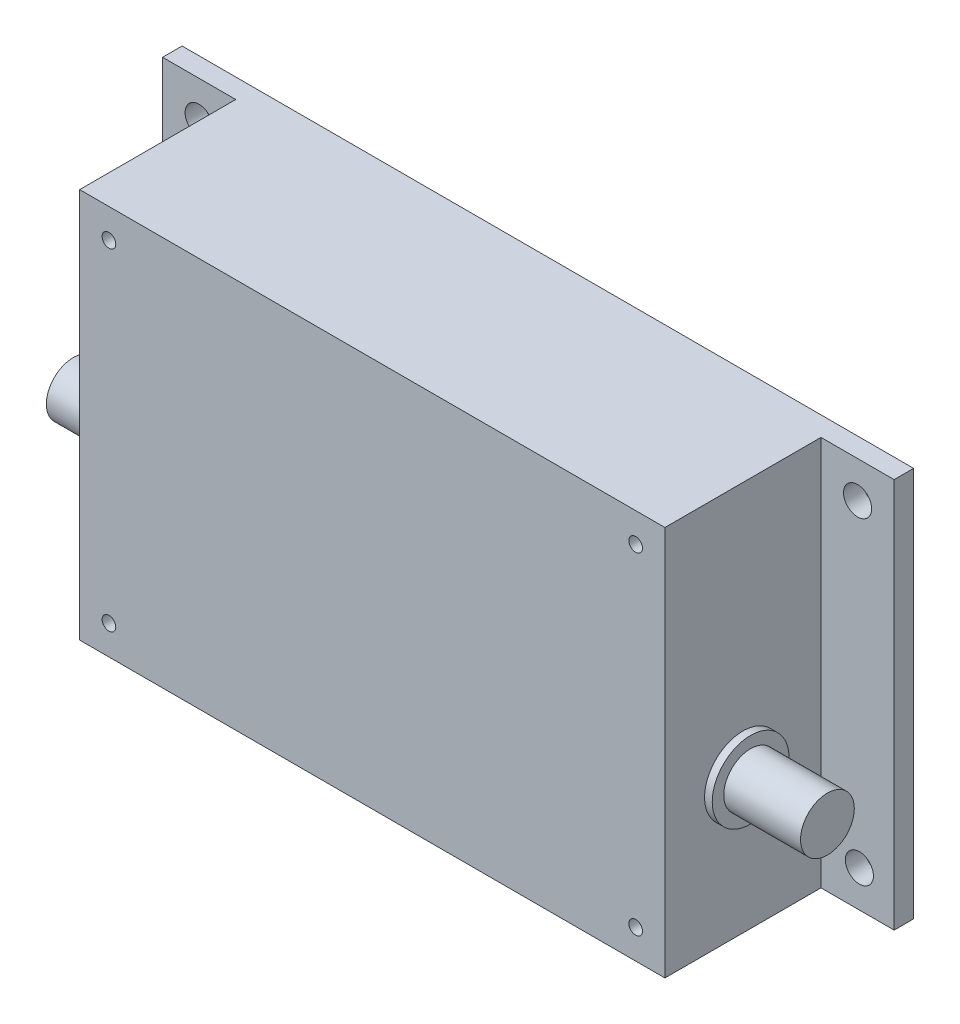
ISO-10303-21;
HEADER;
FILE_DESCRIPTION(('STEP AP214'),'2;1');
FILE_NAME('part.step','',(''),(''),'','','');
FILE_SCHEMA(('AUTOMOTIVE_DESIGN { 1 0 10303 214 1 1 1 1 }'));
ENDSEC;
DATA;
#1=APPLICATION_CONTEXT('core data for automotive mechanical design processes');
#2=APPLICATION_PROTOCOL_DEFINITION('international standard','automotive_design',2000,#1);
#3=PRODUCT_CONTEXT('',#1,'mechanical');
#4=PRODUCT('Part','Part','',(#3));
#5=PRODUCT_RELATED_PRODUCT_CATEGORY('part','',(#4));
#6=PRODUCT_DEFINITION_FORMATION('','',#4);
#7=PRODUCT_DEFINITION_CONTEXT('part definition',#1,'design');
#8=PRODUCT_DEFINITION('design','',#6,#7);
#9=PRODUCT_DEFINITION_SHAPE('','',#8);
#10=(LENGTH_UNIT() NAMED_UNIT(*) SI_UNIT(.MILLI.,.METRE.));
#11=(NAMED_UNIT(*) PLANE_ANGLE_UNIT() SI_UNIT($,.RADIAN.));
#12=(NAMED_UNIT(*) SI_UNIT($,.STERADIAN.) SOLID_ANGLE_UNIT());
#13=UNCERTAINTY_MEASURE_WITH_UNIT(LENGTH_MEASURE(1.E-05),#10,'distance_accuracy_value','');
#14=(GEOMETRIC_REPRESENTATION_CONTEXT(3) GLOBAL_UNCERTAINTY_ASSIGNED_CONTEXT((#13)) GLOBAL_UNIT_ASSIGNED_CONTEXT((#10,
#11,#12)) REPRESENTATION_CONTEXT('',''));
#15=CARTESIAN_POINT('',(0.,0.,0.));
#16=DIRECTION('',(0.,0.,1.));
#17=DIRECTION('',(1.,0.,0.));
#18=AXIS2_PLACEMENT_3D('',#15,#16,#17);
#19=CARTESIAN_POINT('',(0.,0.,2.54));
#20=DIRECTION('',(0.,0.,1.));
#21=DIRECTION('',(1.,0.,0.));
#22=AXIS2_PLACEMENT_3D('',#19,#20,#21);
#23=PLANE('',#22);
#24=DIRECTION('',(0.,-1.,0.));
#25=VECTOR('',#24,1.);
#26=CARTESIAN_POINT('',(-41.5301030994959,25.6684100853451,2.54));
#27=LINE('',#26,#25);
#28=CARTESIAN_POINT('',(-41.5301030994959,25.6684100853451,2.54));
#29=VERTEX_POINT('',#28);
#30=CARTESIAN_POINT('',(-41.5301030994959,-25.1315899146549,2.54));
#31=VERTEX_POINT('',#30);
#32=EDGE_CURVE('E58',#29,#31,#27,.T.);
#33=ORIENTED_EDGE('',*,*,#32,.F.);
#34=DIRECTION('',(-1.,0.,0.));
#35=VECTOR('',#34,1.);
#36=CARTESIAN_POINT('',(-51.0551030994959,25.6684100853451,2.54));
#37=LINE('',#36,#35);
#38=CARTESIAN_POINT('',(-51.0551030994959,25.6684100853451,2.54));
#39=VERTEX_POINT('',#38);
#40=EDGE_CURVE('E239',#29,#39,#37,.T.);
#41=ORIENTED_EDGE('',*,*,#40,.T.);
#42=DIRECTION('',(0.,-1.,0.));
#43=VECTOR('',#42,1.);
#44=CARTESIAN_POINT('',(-51.0551030994959,25.6684100853451,2.54));
#45=LINE('',#44,#43);
#46=CARTESIAN_POINT('',(-51.0551030994959,-25.1315899146549,2.54));
#47=VERTEX_POINT('',#46);
#48=EDGE_CURVE('E227',#39,#47,#45,.T.);
#49=ORIENTED_EDGE('',*,*,#48,.T.);
#50=DIRECTION('',(1.,0.,0.));
#51=VECTOR('',#50,1.);
#52=CARTESIAN_POINT('',(-51.0551030994959,-25.1315899146549,2.54));
#53=LINE('',#52,#51);
#54=EDGE_CURVE('E233',#47,#31,#53,.T.);
#55=ORIENTED_EDGE('',*,*,#54,.T.);
#56=EDGE_LOOP('',(#33,#41,#49,#55));
#57=FACE_BOUND('',#56,.T.);
#58=CARTESIAN_POINT('',(-46.2951030994959,20.9084100853451,2.54));
#59=DIRECTION('',(0.,0.,1.));
#60=DIRECTION('',(1.,0.,0.));
#61=AXIS2_PLACEMENT_3D('',#58,#59,#60);
#62=CIRCLE('',#61,1.83);
#63=CARTESIAN_POINT('',(-44.4651030994959,20.9084100853451,2.54));
#64=VERTEX_POINT('',#63);
#65=EDGE_CURVE('E211',#64,#64,#62,.T.);
#66=ORIENTED_EDGE('',*,*,#65,.F.);
#67=EDGE_LOOP('',(#66));
#68=FACE_BOUND('',#67,.T.);
#69=CARTESIAN_POINT('',(-46.0606937892495,-20.3715899146549,2.54));
#70=DIRECTION('',(0.,0.,1.));
#71=DIRECTION('',(1.,0.,0.));
#72=AXIS2_PLACEMENT_3D('',#69,#70,#71);
#73=CIRCLE('',#72,1.83);
#74=CARTESIAN_POINT('',(-44.2306937892495,-20.3715899146549,2.54));
#75=VERTEX_POINT('',#74);
#76=EDGE_CURVE('E219',#75,#75,#73,.T.);
#77=ORIENTED_EDGE('',*,*,#76,.F.);
#78=EDGE_LOOP('',(#77));
#79=FACE_BOUND('',#78,.T.);
#80=ADVANCED_FACE('F41',(#57,#68,#79),#23,.T.);
#81=DIRECTION('',(0.,1.,0.));
#82=VECTOR('',#81,1.);
#83=CARTESIAN_POINT('',(34.6698969005041,25.6684100853451,2.54));
#84=LINE('',#83,#82);
#85=CARTESIAN_POINT('',(34.6698969005041,-25.1315899146549,2.54));
#86=VERTEX_POINT('',#85);
#87=CARTESIAN_POINT('',(34.6698969005041,25.6684100853451,2.54));
#88=VERTEX_POINT('',#87);
#89=EDGE_CURVE('E66',#86,#88,#84,.T.);
#90=ORIENTED_EDGE('',*,*,#89,.F.);
#91=CARTESIAN_POINT('',(44.1948969005041,-25.1315899146549,2.54));
#92=VERTEX_POINT('',#91);
#93=EDGE_CURVE('E231',#86,#92,#53,.T.);
#94=ORIENTED_EDGE('',*,*,#93,.T.);
#95=DIRECTION('',(0.,1.,0.));
#96=VECTOR('',#95,1.);
#97=CARTESIAN_POINT('',(44.1948969005041,25.6684100853451,2.54));
#98=LINE('',#97,#96);
#99=CARTESIAN_POINT('',(44.1948969005041,25.6684100853451,2.54));
#100=VERTEX_POINT('',#99);
#101=EDGE_CURVE('E236',#92,#100,#98,.T.);
#102=ORIENTED_EDGE('',*,*,#101,.T.);
#103=EDGE_CURVE('E240',#100,#88,#37,.T.);
#104=ORIENTED_EDGE('',*,*,#103,.T.);
#105=EDGE_LOOP('',(#90,#94,#102,#104));
#106=FACE_BOUND('',#105,.T.);
#107=CARTESIAN_POINT('',(39.4348969005041,20.9084100853451,2.54));
#108=DIRECTION('',(0.,0.,1.));
#109=DIRECTION('',(1.,0.,0.));
#110=AXIS2_PLACEMENT_3D('',#107,#108,#109);
#111=CIRCLE('',#110,1.83);
#112=CARTESIAN_POINT('',(41.2648969005041,20.9084100853451,2.54));
#113=VERTEX_POINT('',#112);
#114=EDGE_CURVE('E203',#113,#113,#111,.T.);
#115=ORIENTED_EDGE('',*,*,#114,.F.);
#116=EDGE_LOOP('',(#115));
#117=FACE_BOUND('',#116,.T.);
#118=CARTESIAN_POINT('',(39.6693062107505,-20.3715899146549,2.54));
#119=DIRECTION('',(0.,0.,1.));
#120=DIRECTION('',(1.,0.,0.));
#121=AXIS2_PLACEMENT_3D('',#118,#119,#120);
#122=CIRCLE('',#121,1.83);
#123=CARTESIAN_POINT('',(41.4993062107505,-20.3715899146549,2.54));
#124=VERTEX_POINT('',#123);
#125=EDGE_CURVE('E195',#124,#124,#122,.T.);
#126=ORIENTED_EDGE('',*,*,#125,.F.);
#127=EDGE_LOOP('',(#126));
#128=FACE_BOUND('',#127,.T.);
#129=ADVANCED_FACE('F309',(#106,#117,#128),#23,.T.);
#130=CARTESIAN_POINT('',(0.,0.,0.));
#131=DIRECTION('',(0.,0.,1.));
#132=DIRECTION('',(1.,0.,0.));
#133=AXIS2_PLACEMENT_3D('',#130,#131,#132);
#134=PLANE('',#133);
#135=DIRECTION('',(0.,-1.,0.));
#136=VECTOR('',#135,1.);
#137=CARTESIAN_POINT('',(-51.0551030994959,25.6684100853451,0.));
#138=LINE('',#137,#136);
#139=CARTESIAN_POINT('',(-51.0551030994959,25.6684100853451,0.));
#140=VERTEX_POINT('',#139);
#141=CARTESIAN_POINT('',(-51.0551030994959,-25.1315899146549,0.));
#142=VERTEX_POINT('',#141);
#143=EDGE_CURVE('E223',#140,#142,#138,.T.);
#144=ORIENTED_EDGE('',*,*,#143,.F.);
#145=DIRECTION('',(-1.,0.,0.));
#146=VECTOR('',#145,1.);
#147=CARTESIAN_POINT('',(-51.0551030994959,25.6684100853451,0.));
#148=LINE('',#147,#146);
#149=CARTESIAN_POINT('',(44.1948969005041,25.6684100853451,0.));
#150=VERTEX_POINT('',#149);
#151=EDGE_CURVE('E232',#150,#140,#148,.T.);
#152=ORIENTED_EDGE('',*,*,#151,.F.);
#153=DIRECTION('',(0.,1.,0.));
#154=VECTOR('',#153,1.);
#155=CARTESIAN_POINT('',(44.1948969005041,25.6684100853451,0.));
#156=LINE('',#155,#154);
#157=CARTESIAN_POINT('',(44.1948969005041,-25.1315899146549,0.));
#158=VERTEX_POINT('',#157);
#159=EDGE_CURVE('E250',#158,#150,#156,.T.);
#160=ORIENTED_EDGE('',*,*,#159,.F.);
#161=DIRECTION('',(1.,0.,0.));
#162=VECTOR('',#161,1.);
#163=CARTESIAN_POINT('',(-51.0551030994959,-25.1315899146549,0.));
#164=LINE('',#163,#162);
#165=EDGE_CURVE('E247',#142,#158,#164,.T.);
#166=ORIENTED_EDGE('',*,*,#165,.F.);
#167=EDGE_LOOP('',(#144,#152,#160,#166));
#168=FACE_BOUND('',#167,.T.);
#169=CARTESIAN_POINT('',(-46.0606937892495,-20.3715899146549,0.));
#170=DIRECTION('',(0.,0.,1.));
#171=DIRECTION('',(1.,0.,0.));
#172=AXIS2_PLACEMENT_3D('',#169,#170,#171);
#173=CIRCLE('',#172,1.83);
#174=CARTESIAN_POINT('',(-44.2306937892495,-20.3715899146549,0.));
#175=VERTEX_POINT('',#174);
#176=EDGE_CURVE('E215',#175,#175,#173,.T.);
#177=ORIENTED_EDGE('',*,*,#176,.T.);
#178=EDGE_LOOP('',(#177));
#179=FACE_BOUND('',#178,.T.);
#180=CARTESIAN_POINT('',(-46.2951030994959,20.9084100853451,0.));
#181=DIRECTION('',(0.,0.,1.));
#182=DIRECTION('',(1.,0.,0.));
#183=AXIS2_PLACEMENT_3D('',#180,#181,#182);
#184=CIRCLE('',#183,1.83);
#185=CARTESIAN_POINT('',(-44.4651030994959,20.9084100853451,0.));
#186=VERTEX_POINT('',#185);
#187=EDGE_CURVE('E207',#186,#186,#184,.T.);
#188=ORIENTED_EDGE('',*,*,#187,.T.);
#189=EDGE_LOOP('',(#188));
#190=FACE_BOUND('',#189,.T.);
#191=CARTESIAN_POINT('',(39.4348969005041,20.9084100853451,0.));
#192=DIRECTION('',(0.,0.,1.));
#193=DIRECTION('',(1.,0.,0.));
#194=AXIS2_PLACEMENT_3D('',#191,#192,#193);
#195=CIRCLE('',#194,1.83);
#196=CARTESIAN_POINT('',(41.2648969005041,20.9084100853451,0.));
#197=VERTEX_POINT('',#196);
#198=EDGE_CURVE('E199',#197,#197,#195,.T.);
#199=ORIENTED_EDGE('',*,*,#198,.T.);
#200=EDGE_LOOP('',(#199));
#201=FACE_BOUND('',#200,.T.);
#202=CARTESIAN_POINT('',(39.6693062107505,-20.3715899146549,0.));
#203=DIRECTION('',(0.,0.,1.));
#204=DIRECTION('',(1.,0.,0.));
#205=AXIS2_PLACEMENT_3D('',#202,#203,#204);
#206=CIRCLE('',#205,1.83);
#207=CARTESIAN_POINT('',(41.4993062107505,-20.3715899146549,0.));
#208=VERTEX_POINT('',#207);
#209=EDGE_CURVE('E194',#208,#208,#206,.T.);
#210=ORIENTED_EDGE('',*,*,#209,.T.);
#211=EDGE_LOOP('',(#210));
#212=FACE_BOUND('',#211,.T.);
#213=ADVANCED_FACE('F314',(#168,#179,#190,#201,#212),#134,.F.);
#214=CARTESIAN_POINT('',(-51.0551030994959,25.6684100853451,2.54));
#215=DIRECTION('',(1.,0.,0.));
#216=DIRECTION('',(0.,1.,0.));
#217=AXIS2_PLACEMENT_3D('',#214,#215,#216);
#218=PLANE('',#217);
#219=ORIENTED_EDGE('',*,*,#143,.T.);
#220=DIRECTION('',(0.,0.,-1.));
#221=VECTOR('',#220,1.);
#222=CARTESIAN_POINT('',(-51.0551030994959,-25.1315899146549,2.54));
#223=LINE('',#222,#221);
#224=EDGE_CURVE('E266',#47,#142,#223,.T.);
#225=ORIENTED_EDGE('',*,*,#224,.F.);
#226=ORIENTED_EDGE('',*,*,#48,.F.);
#227=DIRECTION('',(0.,0.,-1.));
#228=VECTOR('',#227,1.);
#229=CARTESIAN_POINT('',(-51.0551030994959,25.6684100853451,2.54));
#230=LINE('',#229,#228);
#231=EDGE_CURVE('E243',#39,#140,#230,.T.);
#232=ORIENTED_EDGE('',*,*,#231,.T.);
#233=EDGE_LOOP('',(#219,#225,#226,#232));
#234=FACE_BOUND('',#233,.T.);
#235=ADVANCED_FACE('F43',(#234),#218,.F.);
#236=CARTESIAN_POINT('',(-51.0551030994959,-25.1315899146549,2.54));
#237=DIRECTION('',(0.,1.,0.));
#238=DIRECTION('',(0.,0.,1.));
#239=AXIS2_PLACEMENT_3D('',#236,#237,#238);
#240=PLANE('',#239);
#241=ORIENTED_EDGE('',*,*,#165,.T.);
#242=DIRECTION('',(0.,0.,-1.));
#243=VECTOR('',#242,1.);
#244=CARTESIAN_POINT('',(44.1948969005041,-25.1315899146549,2.54));
#245=LINE('',#244,#243);
#246=EDGE_CURVE('E262',#92,#158,#245,.T.);
#247=ORIENTED_EDGE('',*,*,#246,.F.);
#248=ORIENTED_EDGE('',*,*,#93,.F.);
#249=DIRECTION('',(0.,0.,-1.));
#250=VECTOR('',#249,1.);
#251=CARTESIAN_POINT('',(34.6698969005041,-25.1315899146549,22.86));
#252=LINE('',#251,#250);
#253=CARTESIAN_POINT('',(34.6698969005041,-25.1315899146549,22.86));
#254=VERTEX_POINT('',#253);
#255=EDGE_CURVE('E186',#254,#86,#252,.T.);
#256=ORIENTED_EDGE('',*,*,#255,.F.);
#257=DIRECTION('',(1.,0.,0.));
#258=VECTOR('',#257,1.);
#259=CARTESIAN_POINT('',(-41.5301030994959,-25.1315899146549,22.86));
#260=LINE('',#259,#258);
#261=CARTESIAN_POINT('',(-41.5301030994959,-25.1315899146549,22.86));
#262=VERTEX_POINT('',#261);
#263=EDGE_CURVE('E165',#262,#254,#260,.T.);
#264=ORIENTED_EDGE('',*,*,#263,.F.);
#265=DIRECTION('',(0.,0.,-1.));
#266=VECTOR('',#265,1.);
#267=CARTESIAN_POINT('',(-41.5301030994959,-25.1315899146549,22.86));
#268=LINE('',#267,#266);
#269=EDGE_CURVE('E190',#262,#31,#268,.T.);
#270=ORIENTED_EDGE('',*,*,#269,.T.);
#271=ORIENTED_EDGE('',*,*,#54,.F.);
#272=ORIENTED_EDGE('',*,*,#224,.T.);
#273=EDGE_LOOP('',(#241,#247,#248,#256,#264,#270,#271,#272));
#274=FACE_BOUND('',#273,.T.);
#275=ADVANCED_FACE('F329',(#274),#240,.F.);
#276=CARTESIAN_POINT('',(44.1948969005041,25.6684100853451,2.54));
#277=DIRECTION('',(-1.,0.,0.));
#278=DIRECTION('',(0.,0.,1.));
#279=AXIS2_PLACEMENT_3D('',#276,#277,#278);
#280=PLANE('',#279);
#281=ORIENTED_EDGE('',*,*,#159,.T.);
#282=DIRECTION('',(0.,0.,-1.));
#283=VECTOR('',#282,1.);
#284=CARTESIAN_POINT('',(44.1948969005041,25.6684100853451,2.54));
#285=LINE('',#284,#283);
#286=EDGE_CURVE('E258',#100,#150,#285,.T.);
#287=ORIENTED_EDGE('',*,*,#286,.F.);
#288=ORIENTED_EDGE('',*,*,#101,.F.);
#289=ORIENTED_EDGE('',*,*,#246,.T.);
#290=EDGE_LOOP('',(#281,#287,#288,#289));
#291=FACE_BOUND('',#290,.T.);
#292=ADVANCED_FACE('F326',(#291),#280,.F.);
#293=CARTESIAN_POINT('',(-51.0551030994959,25.6684100853451,2.54));
#294=DIRECTION('',(0.,-1.,0.));
#295=DIRECTION('',(0.,0.,-1.));
#296=AXIS2_PLACEMENT_3D('',#293,#294,#295);
#297=PLANE('',#296);
#298=ORIENTED_EDGE('',*,*,#151,.T.);
#299=ORIENTED_EDGE('',*,*,#231,.F.);
#300=ORIENTED_EDGE('',*,*,#40,.F.);
#301=DIRECTION('',(0.,0.,-1.));
#302=VECTOR('',#301,1.);
#303=CARTESIAN_POINT('',(-41.5301030994959,25.6684100853451,22.86));
#304=LINE('',#303,#302);
#305=CARTESIAN_POINT('',(-41.5301030994959,25.6684100853451,22.86));
#306=VERTEX_POINT('',#305);
#307=EDGE_CURVE('E174',#306,#29,#304,.T.);
#308=ORIENTED_EDGE('',*,*,#307,.F.);
#309=DIRECTION('',(-1.,0.,0.));
#310=VECTOR('',#309,1.);
#311=CARTESIAN_POINT('',(-41.5301030994959,25.6684100853451,22.86));
#312=LINE('',#311,#310);
#313=CARTESIAN_POINT('',(34.6698969005041,25.6684100853451,22.86));
#314=VERTEX_POINT('',#313);
#315=EDGE_CURVE('E171',#314,#306,#312,.T.);
#316=ORIENTED_EDGE('',*,*,#315,.F.);
#317=DIRECTION('',(0.,0.,-1.));
#318=VECTOR('',#317,1.);
#319=CARTESIAN_POINT('',(34.6698969005041,25.6684100853451,22.86));
#320=LINE('',#319,#318);
#321=EDGE_CURVE('E182',#314,#88,#320,.T.);
#322=ORIENTED_EDGE('',*,*,#321,.T.);
#323=ORIENTED_EDGE('',*,*,#103,.F.);
#324=ORIENTED_EDGE('',*,*,#286,.T.);
#325=EDGE_LOOP('',(#298,#299,#300,#308,#316,#322,#323,#324));
#326=FACE_BOUND('',#325,.T.);
#327=ADVANCED_FACE('F323',(#326),#297,.F.);
#328=CARTESIAN_POINT('',(-46.0606937892495,-20.3715899146549,2.54));
#329=DIRECTION('',(0.,0.,-1.));
#330=DIRECTION('',(-1.,0.,0.));
#331=AXIS2_PLACEMENT_3D('',#328,#329,#330);
#332=CYLINDRICAL_SURFACE('',#331,1.83);
#333=ORIENTED_EDGE('',*,*,#76,.T.);
#334=EDGE_LOOP('',(#333));
#335=FACE_BOUND('',#334,.T.);
#336=ORIENTED_EDGE('',*,*,#176,.F.);
#337=EDGE_LOOP('',(#336));
#338=FACE_BOUND('',#337,.T.);
#339=ADVANCED_FACE('F318',(#335,#338),#332,.F.);
#340=CARTESIAN_POINT('',(-46.2951030994959,20.9084100853451,2.54));
#341=DIRECTION('',(0.,0.,-1.));
#342=DIRECTION('',(-1.,0.,0.));
#343=AXIS2_PLACEMENT_3D('',#340,#341,#342);
#344=CYLINDRICAL_SURFACE('',#343,1.83);
#345=ORIENTED_EDGE('',*,*,#65,.T.);
#346=EDGE_LOOP('',(#345));
#347=FACE_BOUND('',#346,.T.);
#348=ORIENTED_EDGE('',*,*,#187,.F.);
#349=EDGE_LOOP('',(#348));
#350=FACE_BOUND('',#349,.T.);
#351=ADVANCED_FACE('F382',(#347,#350),#344,.F.);
#352=CARTESIAN_POINT('',(39.4348969005041,20.9084100853451,2.54));
#353=DIRECTION('',(0.,0.,-1.));
#354=DIRECTION('',(-1.,0.,0.));
#355=AXIS2_PLACEMENT_3D('',#352,#353,#354);
#356=CYLINDRICAL_SURFACE('',#355,1.83);
#357=ORIENTED_EDGE('',*,*,#114,.T.);
#358=EDGE_LOOP('',(#357));
#359=FACE_BOUND('',#358,.T.);
#360=ORIENTED_EDGE('',*,*,#198,.F.);
#361=EDGE_LOOP('',(#360));
#362=FACE_BOUND('',#361,.T.);
#363=ADVANCED_FACE('F374',(#359,#362),#356,.F.);
#364=CARTESIAN_POINT('',(39.6693062107505,-20.3715899146549,2.54));
#365=DIRECTION('',(0.,0.,-1.));
#366=DIRECTION('',(-1.,0.,0.));
#367=AXIS2_PLACEMENT_3D('',#364,#365,#366);
#368=CYLINDRICAL_SURFACE('',#367,1.83);
#369=ORIENTED_EDGE('',*,*,#125,.T.);
#370=EDGE_LOOP('',(#369));
#371=FACE_BOUND('',#370,.T.);
#372=ORIENTED_EDGE('',*,*,#209,.F.);
#373=EDGE_LOOP('',(#372));
#374=FACE_BOUND('',#373,.T.);
#375=ADVANCED_FACE('F365',(#371,#374),#368,.F.);
#376=CARTESIAN_POINT('',(-41.5301030994959,25.6684100853451,22.86));
#377=DIRECTION('',(1.,0.,0.));
#378=DIRECTION('',(0.,1.,0.));
#379=AXIS2_PLACEMENT_3D('',#376,#377,#378);
#380=PLANE('',#379);
#381=CARTESIAN_POINT('',(-41.5301030994959,12.9684100853451,10.16));
#382=DIRECTION('',(1.,0.,0.));
#383=DIRECTION('',(0.,1.,0.));
#384=AXIS2_PLACEMENT_3D('',#381,#382,#383);
#385=CIRCLE('',#384,4.);
#386=CARTESIAN_POINT('',(-41.5301030994959,16.9684100853451,10.16));
#387=VERTEX_POINT('',#386);
#388=EDGE_CURVE('E11',#387,#387,#385,.F.);
#389=ORIENTED_EDGE('',*,*,#388,.F.);
#390=EDGE_LOOP('',(#389));
#391=FACE_BOUND('',#390,.T.);
#392=CARTESIAN_POINT('',(-41.5301030994959,-7.35158991465492,12.7));
#393=DIRECTION('',(1.,0.,0.));
#394=DIRECTION('',(0.,1.,0.));
#395=AXIS2_PLACEMENT_3D('',#392,#393,#394);
#396=CIRCLE('',#395,5.);
#397=CARTESIAN_POINT('',(-41.5301030994959,-2.35158991465492,12.7));
#398=VERTEX_POINT('',#397);
#399=EDGE_CURVE('E270',#398,#398,#396,.F.);
#400=ORIENTED_EDGE('',*,*,#399,.F.);
#401=EDGE_LOOP('',(#400));
#402=FACE_BOUND('',#401,.T.);
#403=ORIENTED_EDGE('',*,*,#32,.T.);
#404=ORIENTED_EDGE('',*,*,#269,.F.);
#405=DIRECTION('',(0.,-1.,0.));
#406=VECTOR('',#405,1.);
#407=CARTESIAN_POINT('',(-41.5301030994959,25.6684100853451,22.86));
#408=LINE('',#407,#406);
#409=EDGE_CURVE('E161',#306,#262,#408,.T.);
#410=ORIENTED_EDGE('',*,*,#409,.F.);
#411=ORIENTED_EDGE('',*,*,#307,.T.);
#412=EDGE_LOOP('',(#403,#404,#410,#411));
#413=FACE_BOUND('',#412,.T.);
#414=ADVANCED_FACE('F363',(#391,#402,#413),#380,.F.);
#415=CARTESIAN_POINT('',(34.6698969005041,25.6684100853451,22.86));
#416=DIRECTION('',(-1.,0.,0.));
#417=DIRECTION('',(0.,0.,1.));
#418=AXIS2_PLACEMENT_3D('',#415,#416,#417);
#419=PLANE('',#418);
#420=CARTESIAN_POINT('',(34.6698969005041,-7.35158991465492,12.7));
#421=DIRECTION('',(-1.,0.,0.));
#422=DIRECTION('',(0.,0.,1.));
#423=AXIS2_PLACEMENT_3D('',#420,#421,#422);
#424=CIRCLE('',#423,5.);
#425=CARTESIAN_POINT('',(34.6698969005041,-7.35158991465492,17.7));
#426=VERTEX_POINT('',#425);
#427=EDGE_CURVE('E279',#426,#426,#424,.F.);
#428=ORIENTED_EDGE('',*,*,#427,.F.);
#429=EDGE_LOOP('',(#428));
#430=FACE_BOUND('',#429,.T.);
#431=ORIENTED_EDGE('',*,*,#89,.T.);
#432=ORIENTED_EDGE('',*,*,#321,.F.);
#433=DIRECTION('',(0.,1.,0.));
#434=VECTOR('',#433,1.);
#435=CARTESIAN_POINT('',(34.6698969005041,25.6684100853451,22.86));
#436=LINE('',#435,#434);
#437=EDGE_CURVE('E168',#254,#314,#436,.T.);
#438=ORIENTED_EDGE('',*,*,#437,.F.);
#439=ORIENTED_EDGE('',*,*,#255,.T.);
#440=EDGE_LOOP('',(#431,#432,#438,#439));
#441=FACE_BOUND('',#440,.T.);
#442=ADVANCED_FACE('F355',(#430,#441),#419,.F.);
#443=CARTESIAN_POINT('',(0.,0.,22.86));
#444=DIRECTION('',(0.,0.,1.));
#445=DIRECTION('',(1.,0.,0.));
#446=AXIS2_PLACEMENT_3D('',#443,#444,#445);
#447=PLANE('',#446);
#448=CARTESIAN_POINT('',(-37.7201030994959,21.8584100853451,22.86));
#449=DIRECTION('',(0.,0.,1.));
#450=DIRECTION('',(1.,0.,0.));
#451=AXIS2_PLACEMENT_3D('',#448,#449,#450);
#452=CIRCLE('',#451,0.888999999999987);
#453=CARTESIAN_POINT('',(-36.8311030994959,21.8584100853451,22.86));
#454=VERTEX_POINT('',#453);
#455=EDGE_CURVE('E130',#454,#454,#452,.T.);
#456=ORIENTED_EDGE('',*,*,#455,.F.);
#457=EDGE_LOOP('',(#456));
#458=FACE_BOUND('',#457,.T.);
#459=CARTESIAN_POINT('',(30.8598969005041,21.8584100853451,22.86));
#460=DIRECTION('',(0.,0.,1.));
#461=DIRECTION('',(1.,0.,0.));
#462=AXIS2_PLACEMENT_3D('',#459,#460,#461);
#463=CIRCLE('',#462,0.888999999999987);
#464=CARTESIAN_POINT('',(31.7488969005041,21.8584100853451,22.86));
#465=VERTEX_POINT('',#464);
#466=EDGE_CURVE('E129',#465,#465,#463,.T.);
#467=ORIENTED_EDGE('',*,*,#466,.F.);
#468=EDGE_LOOP('',(#467));
#469=FACE_BOUND('',#468,.T.);
#470=CARTESIAN_POINT('',(30.8598969005041,-21.3215899146549,22.86));
#471=DIRECTION('',(0.,0.,1.));
#472=DIRECTION('',(1.,0.,0.));
#473=AXIS2_PLACEMENT_3D('',#470,#471,#472);
#474=CIRCLE('',#473,0.888999999999987);
#475=CARTESIAN_POINT('',(31.7488969005041,-21.3215899146549,22.86));
#476=VERTEX_POINT('',#475);
#477=EDGE_CURVE('E145',#476,#476,#474,.T.);
#478=ORIENTED_EDGE('',*,*,#477,.F.);
#479=EDGE_LOOP('',(#478));
#480=FACE_BOUND('',#479,.T.);
#481=CARTESIAN_POINT('',(-37.7201030994959,-21.3215899146549,22.86));
#482=DIRECTION('',(0.,0.,1.));
#483=DIRECTION('',(1.,0.,0.));
#484=AXIS2_PLACEMENT_3D('',#481,#482,#483);
#485=CIRCLE('',#484,0.888999999999987);
#486=CARTESIAN_POINT('',(-36.8311030994959,-21.3215899146549,22.86));
#487=VERTEX_POINT('',#486);
#488=EDGE_CURVE('E153',#487,#487,#485,.T.);
#489=ORIENTED_EDGE('',*,*,#488,.F.);
#490=EDGE_LOOP('',(#489));
#491=FACE_BOUND('',#490,.T.);
#492=ORIENTED_EDGE('',*,*,#409,.T.);
#493=ORIENTED_EDGE('',*,*,#263,.T.);
#494=ORIENTED_EDGE('',*,*,#437,.T.);
#495=ORIENTED_EDGE('',*,*,#315,.T.);
#496=EDGE_LOOP('',(#492,#493,#494,#495));
#497=FACE_BOUND('',#496,.T.);
#498=ADVANCED_FACE('F359',(#458,#469,#480,#491,#497),#447,.T.);
#499=CARTESIAN_POINT('',(-37.7201030994959,-21.3215899146549,17.86));
#500=DIRECTION('',(0.,0.,1.));
#501=DIRECTION('',(1.,0.,0.));
#502=AXIS2_PLACEMENT_3D('',#499,#500,#501);
#503=CONICAL_SURFACE('',#502,0.888999999999987,1.02974425867665);
#504=CARTESIAN_POINT('',(-37.7201030994959,-21.3215899146549,17.3258349096845));
#505=VERTEX_POINT('',#504);
#506=VERTEX_LOOP('',#505);
#507=FACE_BOUND('',#506,.T.);
#508=CARTESIAN_POINT('',(-37.7201030994959,-21.3215899146549,17.86));
#509=DIRECTION('',(0.,0.,1.));
#510=DIRECTION('',(1.,0.,0.));
#511=AXIS2_PLACEMENT_3D('',#508,#509,#510);
#512=CIRCLE('',#511,0.888999999999987);
#513=CARTESIAN_POINT('',(-36.8311030994959,-21.3215899146549,17.86));
#514=VERTEX_POINT('',#513);
#515=EDGE_CURVE('E157',#514,#514,#512,.T.);
#516=ORIENTED_EDGE('',*,*,#515,.T.);
#517=EDGE_LOOP('',(#516));
#518=FACE_BOUND('',#517,.T.);
#519=ADVANCED_FACE('F473',(#507,#518),#503,.F.);
#520=CARTESIAN_POINT('',(-37.7201030994959,-21.3215899146549,22.86));
#521=DIRECTION('',(0.,0.,1.));
#522=DIRECTION('',(1.,0.,0.));
#523=AXIS2_PLACEMENT_3D('',#520,#521,#522);
#524=CYLINDRICAL_SURFACE('',#523,0.888999999999987);
#525=ORIENTED_EDGE('',*,*,#515,.F.);
#526=EDGE_LOOP('',(#525));
#527=FACE_BOUND('',#526,.T.);
#528=ORIENTED_EDGE('',*,*,#488,.T.);
#529=EDGE_LOOP('',(#528));
#530=FACE_BOUND('',#529,.T.);
#531=ADVANCED_FACE('F481',(#527,#530),#524,.F.);
#532=CARTESIAN_POINT('',(30.8598969005041,-21.3215899146549,17.86));
#533=DIRECTION('',(0.,0.,1.));
#534=DIRECTION('',(1.,0.,0.));
#535=AXIS2_PLACEMENT_3D('',#532,#533,#534);
#536=CONICAL_SURFACE('',#535,0.888999999999987,1.02974425867665);
#537=CARTESIAN_POINT('',(30.8598969005041,-21.3215899146549,17.3258349096845));
#538=VERTEX_POINT('',#537);
#539=VERTEX_LOOP('',#538);
#540=FACE_BOUND('',#539,.T.);
#541=CARTESIAN_POINT('',(30.8598969005041,-21.3215899146549,17.86));
#542=DIRECTION('',(0.,0.,1.));
#543=DIRECTION('',(1.,0.,0.));
#544=AXIS2_PLACEMENT_3D('',#541,#542,#543);
#545=CIRCLE('',#544,0.888999999999987);
#546=CARTESIAN_POINT('',(31.7488969005041,-21.3215899146549,17.86));
#547=VERTEX_POINT('',#546);
#548=EDGE_CURVE('E149',#547,#547,#545,.T.);
#549=ORIENTED_EDGE('',*,*,#548,.T.);
#550=EDGE_LOOP('',(#549));
#551=FACE_BOUND('',#550,.T.);
#552=ADVANCED_FACE('F490',(#540,#551),#536,.F.);
#553=CARTESIAN_POINT('',(30.8598969005041,-21.3215899146549,22.86));
#554=DIRECTION('',(0.,0.,1.));
#555=DIRECTION('',(1.,0.,0.));
#556=AXIS2_PLACEMENT_3D('',#553,#554,#555);
#557=CYLINDRICAL_SURFACE('',#556,0.888999999999987);
#558=ORIENTED_EDGE('',*,*,#548,.F.);
#559=EDGE_LOOP('',(#558));
#560=FACE_BOUND('',#559,.T.);
#561=ORIENTED_EDGE('',*,*,#477,.T.);
#562=EDGE_LOOP('',(#561));
#563=FACE_BOUND('',#562,.T.);
#564=ADVANCED_FACE('F499',(#560,#563),#557,.F.);
#565=CARTESIAN_POINT('',(30.8598969005041,21.8584100853451,17.86));
#566=DIRECTION('',(0.,0.,1.));
#567=DIRECTION('',(1.,0.,0.));
#568=AXIS2_PLACEMENT_3D('',#565,#566,#567);
#569=CONICAL_SURFACE('',#568,0.888999999999987,1.02974425867665);
#570=CARTESIAN_POINT('',(30.8598969005041,21.8584100853451,17.3258349096845));
#571=VERTEX_POINT('',#570);
#572=VERTEX_LOOP('',#571);
#573=FACE_BOUND('',#572,.T.);
#574=CARTESIAN_POINT('',(30.8598969005041,21.8584100853451,17.86));
#575=DIRECTION('',(0.,0.,1.));
#576=DIRECTION('',(1.,0.,0.));
#577=AXIS2_PLACEMENT_3D('',#574,#575,#576);
#578=CIRCLE('',#577,0.888999999999987);
#579=CARTESIAN_POINT('',(31.7488969005041,21.8584100853451,17.86));
#580=VERTEX_POINT('',#579);
#581=EDGE_CURVE('E135',#580,#580,#578,.T.);
#582=ORIENTED_EDGE('',*,*,#581,.T.);
#583=EDGE_LOOP('',(#582));
#584=FACE_BOUND('',#583,.T.);
#585=ADVANCED_FACE('F508',(#573,#584),#569,.F.);
#586=CARTESIAN_POINT('',(30.8598969005041,21.8584100853451,22.86));
#587=DIRECTION('',(0.,0.,1.));
#588=DIRECTION('',(1.,0.,0.));
#589=AXIS2_PLACEMENT_3D('',#586,#587,#588);
#590=CYLINDRICAL_SURFACE('',#589,0.888999999999987);
#591=ORIENTED_EDGE('',*,*,#581,.F.);
#592=EDGE_LOOP('',(#591));
#593=FACE_BOUND('',#592,.T.);
#594=ORIENTED_EDGE('',*,*,#466,.T.);
#595=EDGE_LOOP('',(#594));
#596=FACE_BOUND('',#595,.T.);
#597=ADVANCED_FACE('F122',(#593,#596),#590,.F.);
#598=CARTESIAN_POINT('',(-37.7201030994959,21.8584100853451,17.86));
#599=DIRECTION('',(0.,0.,1.));
#600=DIRECTION('',(1.,0.,0.));
#601=AXIS2_PLACEMENT_3D('',#598,#599,#600);
#602=CONICAL_SURFACE('',#601,0.888999999999987,1.02974425867665);
#603=CARTESIAN_POINT('',(-37.7201030994959,21.8584100853451,17.3258349096845));
#604=VERTEX_POINT('',#603);
#605=VERTEX_LOOP('',#604);
#606=FACE_BOUND('',#605,.T.);
#607=CARTESIAN_POINT('',(-37.7201030994959,21.8584100853451,17.86));
#608=DIRECTION('',(0.,0.,1.));
#609=DIRECTION('',(1.,0.,0.));
#610=AXIS2_PLACEMENT_3D('',#607,#608,#609);
#611=CIRCLE('',#610,0.888999999999987);
#612=CARTESIAN_POINT('',(-36.8311030994959,21.8584100853451,17.86));
#613=VERTEX_POINT('',#612);
#614=EDGE_CURVE('E126',#613,#613,#611,.T.);
#615=ORIENTED_EDGE('',*,*,#614,.T.);
#616=EDGE_LOOP('',(#615));
#617=FACE_BOUND('',#616,.T.);
#618=ADVANCED_FACE('F118',(#606,#617),#602,.F.);
#619=CARTESIAN_POINT('',(-37.7201030994959,21.8584100853451,22.86));
#620=DIRECTION('',(0.,0.,1.));
#621=DIRECTION('',(1.,0.,0.));
#622=AXIS2_PLACEMENT_3D('',#619,#620,#621);
#623=CYLINDRICAL_SURFACE('',#622,0.888999999999987);
#624=ORIENTED_EDGE('',*,*,#614,.F.);
#625=EDGE_LOOP('',(#624));
#626=FACE_BOUND('',#625,.T.);
#627=ORIENTED_EDGE('',*,*,#455,.T.);
#628=EDGE_LOOP('',(#627));
#629=FACE_BOUND('',#628,.T.);
#630=ADVANCED_FACE('F121',(#626,#629),#623,.F.);
#631=CARTESIAN_POINT('',(-42.5301030994959,-7.35158991465492,12.7));
#632=DIRECTION('',(1.,0.,0.));
#633=DIRECTION('',(0.,1.,0.));
#634=AXIS2_PLACEMENT_3D('',#631,#632,#633);
#635=CYLINDRICAL_SURFACE('',#634,5.);
#636=CARTESIAN_POINT('',(-42.5301030994959,-7.35158991465492,12.7));
#637=DIRECTION('',(-1.,0.,0.));
#638=DIRECTION('',(0.,-1.,0.));
#639=AXIS2_PLACEMENT_3D('',#636,#637,#638);
#640=CIRCLE('',#639,5.);
#641=CARTESIAN_POINT('',(-42.5301030994959,-12.3515899146549,12.7));
#642=VERTEX_POINT('',#641);
#643=EDGE_CURVE('E275',#642,#642,#640,.T.);
#644=ORIENTED_EDGE('',*,*,#643,.F.);
#645=EDGE_LOOP('',(#644));
#646=FACE_BOUND('',#645,.T.);
#647=ORIENTED_EDGE('',*,*,#399,.T.);
#648=EDGE_LOOP('',(#647));
#649=FACE_BOUND('',#648,.T.);
#650=ADVANCED_FACE('F538',(#646,#649),#635,.T.);
#651=CARTESIAN_POINT('',(-42.5301030994959,-7.35158991465492,12.7));
#652=DIRECTION('',(-1.,0.,0.));
#653=DIRECTION('',(0.,-1.,0.));
#654=AXIS2_PLACEMENT_3D('',#651,#652,#653);
#655=PLANE('',#654);
#656=CARTESIAN_POINT('',(-42.5301030994959,-7.35158991465492,12.7));
#657=DIRECTION('',(-1.,0.,0.));
#658=DIRECTION('',(0.,-1.,0.));
#659=AXIS2_PLACEMENT_3D('',#656,#657,#658);
#660=CIRCLE('',#659,3.5);
#661=CARTESIAN_POINT('',(-42.5301030994959,-10.8515899146549,12.7));
#662=VERTEX_POINT('',#661);
#663=EDGE_CURVE('E271',#662,#662,#660,.T.);
#664=ORIENTED_EDGE('',*,*,#663,.F.);
#665=EDGE_LOOP('',(#664));
#666=FACE_BOUND('',#665,.T.);
#667=ORIENTED_EDGE('',*,*,#643,.T.);
#668=EDGE_LOOP('',(#667));
#669=FACE_BOUND('',#668,.T.);
#670=ADVANCED_FACE('F558',(#666,#669),#655,.T.);
#671=CARTESIAN_POINT('',(-52.5301030994959,-7.35158991465493,12.7));
#672=DIRECTION('',(-1.,0.,0.));
#673=DIRECTION('',(0.,-1.,0.));
#674=AXIS2_PLACEMENT_3D('',#671,#672,#673);
#675=PLANE('',#674);
#676=CARTESIAN_POINT('',(-52.5301030994959,-7.35158991465493,12.7));
#677=DIRECTION('',(-1.,0.,0.));
#678=DIRECTION('',(0.,-1.,0.));
#679=AXIS2_PLACEMENT_3D('',#676,#677,#678);
#680=CIRCLE('',#679,3.5);
#681=CARTESIAN_POINT('',(-52.5301030994959,-10.8515899146549,12.7));
#682=VERTEX_POINT('',#681);
#683=EDGE_CURVE('E138',#682,#682,#680,.T.);
#684=ORIENTED_EDGE('',*,*,#683,.T.);
#685=EDGE_LOOP('',(#684));
#686=FACE_BOUND('',#685,.T.);
#687=ADVANCED_FACE('F549',(#686),#675,.T.);
#688=CARTESIAN_POINT('',(-52.5301030994959,-7.35158991465493,12.7));
#689=DIRECTION('',(1.,0.,0.));
#690=DIRECTION('',(0.,1.,0.));
#691=AXIS2_PLACEMENT_3D('',#688,#689,#690);
#692=CYLINDRICAL_SURFACE('',#691,3.5);
#693=ORIENTED_EDGE('',*,*,#663,.T.);
#694=EDGE_LOOP('',(#693));
#695=FACE_BOUND('',#694,.T.);
#696=ORIENTED_EDGE('',*,*,#683,.F.);
#697=EDGE_LOOP('',(#696));
#698=FACE_BOUND('',#697,.T.);
#699=ADVANCED_FACE('F542',(#695,#698),#692,.T.);
#700=CARTESIAN_POINT('',(35.6698969005041,-7.35158991465492,12.7));
#701=DIRECTION('',(-1.,0.,0.));
#702=DIRECTION('',(0.,0.,1.));
#703=AXIS2_PLACEMENT_3D('',#700,#701,#702);
#704=CYLINDRICAL_SURFACE('',#703,5.);
#705=CARTESIAN_POINT('',(35.6698969005041,-7.35158991465492,12.7));
#706=DIRECTION('',(1.,0.,0.));
#707=DIRECTION('',(0.,0.,-1.));
#708=AXIS2_PLACEMENT_3D('',#705,#706,#707);
#709=CIRCLE('',#708,5.);
#710=CARTESIAN_POINT('',(35.6698969005041,-7.35158991465492,7.7));
#711=VERTEX_POINT('',#710);
#712=EDGE_CURVE('E285',#711,#711,#709,.T.);
#713=ORIENTED_EDGE('',*,*,#712,.F.);
#714=EDGE_LOOP('',(#713));
#715=FACE_BOUND('',#714,.T.);
#716=ORIENTED_EDGE('',*,*,#427,.T.);
#717=EDGE_LOOP('',(#716));
#718=FACE_BOUND('',#717,.T.);
#719=ADVANCED_FACE('F548',(#715,#718),#704,.T.);
#720=CARTESIAN_POINT('',(35.6698969005041,-7.35158991465492,12.7));
#721=DIRECTION('',(1.,0.,0.));
#722=DIRECTION('',(0.,0.,-1.));
#723=AXIS2_PLACEMENT_3D('',#720,#721,#722);
#724=PLANE('',#723);
#725=CARTESIAN_POINT('',(35.6698969005041,-7.35158991465492,12.7));
#726=DIRECTION('',(1.,0.,0.));
#727=DIRECTION('',(0.,0.,-1.));
#728=AXIS2_PLACEMENT_3D('',#725,#726,#727);
#729=CIRCLE('',#728,3.5);
#730=CARTESIAN_POINT('',(35.6698969005041,-7.35158991465492,9.2));
#731=VERTEX_POINT('',#730);
#732=EDGE_CURVE('E280',#731,#731,#729,.T.);
#733=ORIENTED_EDGE('',*,*,#732,.F.);
#734=EDGE_LOOP('',(#733));
#735=FACE_BOUND('',#734,.T.);
#736=ORIENTED_EDGE('',*,*,#712,.T.);
#737=EDGE_LOOP('',(#736));
#738=FACE_BOUND('',#737,.T.);
#739=ADVANCED_FACE('F594',(#735,#738),#724,.T.);
#740=CARTESIAN_POINT('',(45.6698969005041,-7.35158991465492,12.7));
#741=DIRECTION('',(1.,0.,0.));
#742=DIRECTION('',(0.,0.,-1.));
#743=AXIS2_PLACEMENT_3D('',#740,#741,#742);
#744=PLANE('',#743);
#745=CARTESIAN_POINT('',(45.6698969005041,-7.35158991465492,12.7));
#746=DIRECTION('',(1.,0.,0.));
#747=DIRECTION('',(0.,0.,-1.));
#748=AXIS2_PLACEMENT_3D('',#745,#746,#747);
#749=CIRCLE('',#748,3.5);
#750=CARTESIAN_POINT('',(45.6698969005041,-7.35158991465492,9.2));
#751=VERTEX_POINT('',#750);
#752=EDGE_CURVE('E284',#751,#751,#749,.T.);
#753=ORIENTED_EDGE('',*,*,#752,.T.);
#754=EDGE_LOOP('',(#753));
#755=FACE_BOUND('',#754,.T.);
#756=ADVANCED_FACE('F584',(#755),#744,.T.);
#757=CARTESIAN_POINT('',(45.6698969005041,-7.35158991465492,12.7));
#758=DIRECTION('',(-1.,0.,0.));
#759=DIRECTION('',(0.,0.,1.));
#760=AXIS2_PLACEMENT_3D('',#757,#758,#759);
#761=CYLINDRICAL_SURFACE('',#760,3.5);
#762=ORIENTED_EDGE('',*,*,#732,.T.);
#763=EDGE_LOOP('',(#762));
#764=FACE_BOUND('',#763,.T.);
#765=ORIENTED_EDGE('',*,*,#752,.F.);
#766=EDGE_LOOP('',(#765));
#767=FACE_BOUND('',#766,.T.);
#768=ADVANCED_FACE('F577',(#764,#767),#761,.T.);
#769=CARTESIAN_POINT('',(-42.5301030994959,12.9684100853451,10.16));
#770=DIRECTION('',(1.,0.,0.));
#771=DIRECTION('',(0.,1.,0.));
#772=AXIS2_PLACEMENT_3D('',#769,#770,#771);
#773=CYLINDRICAL_SURFACE('',#772,4.);
#774=CARTESIAN_POINT('',(-42.5301030994959,12.9684100853451,10.16));
#775=DIRECTION('',(-1.,0.,0.));
#776=DIRECTION('',(0.,-1.,0.));
#777=AXIS2_PLACEMENT_3D('',#774,#775,#776);
#778=CIRCLE('',#777,4.);
#779=CARTESIAN_POINT('',(-42.5301030994959,8.96841008534508,10.16));
#780=VERTEX_POINT('',#779);
#781=EDGE_CURVE('E678',#780,#780,#778,.T.);
#782=ORIENTED_EDGE('',*,*,#781,.F.);
#783=EDGE_LOOP('',(#782));
#784=FACE_BOUND('',#783,.T.);
#785=ORIENTED_EDGE('',*,*,#388,.T.);
#786=EDGE_LOOP('',(#785));
#787=FACE_BOUND('',#786,.T.);
#788=ADVANCED_FACE('F583',(#784,#787),#773,.T.);
#789=CARTESIAN_POINT('',(-42.5301030994959,12.9684100853451,10.16));
#790=DIRECTION('',(-1.,0.,0.));
#791=DIRECTION('',(0.,-1.,0.));
#792=AXIS2_PLACEMENT_3D('',#789,#790,#791);
#793=PLANE('',#792);
#794=CARTESIAN_POINT('',(-42.5301030994959,12.9684100853451,10.16));
#795=DIRECTION('',(-1.,0.,0.));
#796=DIRECTION('',(0.,-1.,0.));
#797=AXIS2_PLACEMENT_3D('',#794,#795,#796);
#798=CIRCLE('',#797,0.500000000000001);
#799=CARTESIAN_POINT('',(-42.5301030994959,12.4684100853451,10.16));
#800=VERTEX_POINT('',#799);
#801=EDGE_CURVE('E45',#800,#800,#798,.T.);
#802=ORIENTED_EDGE('',*,*,#801,.F.);
#803=EDGE_LOOP('',(#802));
#804=FACE_BOUND('',#803,.T.);
#805=ORIENTED_EDGE('',*,*,#781,.T.);
#806=EDGE_LOOP('',(#805));
#807=FACE_BOUND('',#806,.T.);
#808=ADVANCED_FACE('F617',(#804,#807),#793,.T.);
#809=CARTESIAN_POINT('',(-51.5301030994959,12.9684100853451,10.16));
#810=DIRECTION('',(-1.,0.,0.));
#811=DIRECTION('',(0.,-1.,0.));
#812=AXIS2_PLACEMENT_3D('',#809,#810,#811);
#813=PLANE('',#812);
#814=CARTESIAN_POINT('',(-51.5301030994959,12.9684100853451,10.16));
#815=DIRECTION('',(-1.,0.,0.));
#816=DIRECTION('',(0.,-1.,0.));
#817=AXIS2_PLACEMENT_3D('',#814,#815,#816);
#818=CIRCLE('',#817,1.0593264579036);
#819=CARTESIAN_POINT('',(-51.5301030994959,11.9090836274415,10.16));
#820=VERTEX_POINT('',#819);
#821=EDGE_CURVE('E683',#820,#820,#818,.T.);
#822=ORIENTED_EDGE('',*,*,#821,.T.);
#823=EDGE_LOOP('',(#822));
#824=FACE_BOUND('',#823,.T.);
#825=ADVANCED_FACE('F611',(#824),#813,.T.);
#826=CARTESIAN_POINT('',(-50.5301030994959,12.9684100853451,10.16));
#827=DIRECTION('',(-1.,0.,0.));
#828=DIRECTION('',(0.,-1.,0.));
#829=AXIS2_PLACEMENT_3D('',#826,#827,#828);
#830=CYLINDRICAL_SURFACE('',#829,1.0593264579036);
#831=CARTESIAN_POINT('',(-50.5301030994959,12.9684100853451,10.16));
#832=DIRECTION('',(-1.,0.,0.));
#833=DIRECTION('',(0.,-1.,0.));
#834=AXIS2_PLACEMENT_3D('',#831,#832,#833);
#835=CIRCLE('',#834,1.0593264579036);
#836=CARTESIAN_POINT('',(-50.5301030994959,11.9090836274415,10.16));
#837=VERTEX_POINT('',#836);
#838=EDGE_CURVE('E685',#837,#837,#835,.T.);
#839=ORIENTED_EDGE('',*,*,#838,.T.);
#840=EDGE_LOOP('',(#839));
#841=FACE_BOUND('',#840,.T.);
#842=ORIENTED_EDGE('',*,*,#821,.F.);
#843=EDGE_LOOP('',(#842));
#844=FACE_BOUND('',#843,.T.);
#845=ADVANCED_FACE('F303',(#841,#844),#830,.T.);
#846=CARTESIAN_POINT('',(-50.5301030994959,12.9684100853451,10.16));
#847=DIRECTION('',(-1.,0.,0.));
#848=DIRECTION('',(0.,-1.,0.));
#849=AXIS2_PLACEMENT_3D('',#846,#847,#848);
#850=PLANE('',#849);
#851=CARTESIAN_POINT('',(-50.5301030994959,12.9684100853451,10.16));
#852=DIRECTION('',(-1.,0.,0.));
#853=DIRECTION('',(0.,-1.,0.));
#854=AXIS2_PLACEMENT_3D('',#851,#852,#853);
#855=CIRCLE('',#854,0.500000000000001);
#856=CARTESIAN_POINT('',(-50.5301030994959,12.4684100853451,10.16));
#857=VERTEX_POINT('',#856);
#858=EDGE_CURVE('E51',#857,#857,#855,.T.);
#859=ORIENTED_EDGE('',*,*,#858,.T.);
#860=EDGE_LOOP('',(#859));
#861=FACE_BOUND('',#860,.T.);
#862=ORIENTED_EDGE('',*,*,#838,.F.);
#863=EDGE_LOOP('',(#862));
#864=FACE_BOUND('',#863,.T.);
#865=ADVANCED_FACE('F293',(#861,#864),#850,.F.);
#866=CARTESIAN_POINT('',(-51.5301030994959,12.9684100853451,10.16));
#867=DIRECTION('',(1.,0.,0.));
#868=DIRECTION('',(0.,1.,0.));
#869=AXIS2_PLACEMENT_3D('',#866,#867,#868);
#870=CYLINDRICAL_SURFACE('',#869,0.500000000000001);
#871=ORIENTED_EDGE('',*,*,#801,.T.);
#872=EDGE_LOOP('',(#871));
#873=FACE_BOUND('',#872,.T.);
#874=ORIENTED_EDGE('',*,*,#858,.F.);
#875=EDGE_LOOP('',(#874));
#876=FACE_BOUND('',#875,.T.);
#877=ADVANCED_FACE('F296',(#873,#876),#870,.T.);
#878=CLOSED_SHELL('',(#80,#129,#213,#235,#275,#292,#327,#339,#351,#363,#375,#414,#442,#498,#519,
#531,#552,#564,#585,#597,#618,#630,#650,#670,#687,#699,#719,#739,#756,#768,#788,#808,#825,#845,
#865,#877));
#879=MANIFOLD_SOLID_BREP('B2',#878);
#880=ADVANCED_BREP_SHAPE_REPRESENTATION('',(#18,#879),#14);
#881=SHAPE_DEFINITION_REPRESENTATION(#9,#880);
ENDSEC;
END-ISO-10303-21;
